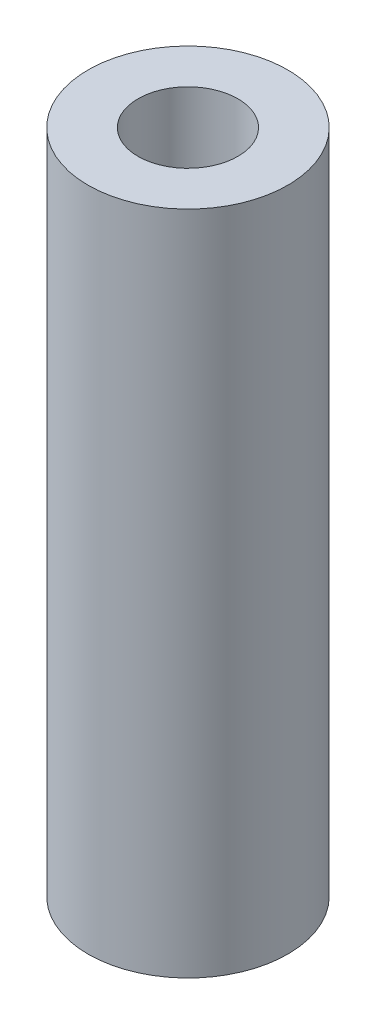
ISO-10303-21;
HEADER;
FILE_DESCRIPTION(('STEP AP214'),'2;1');
FILE_NAME('part.step','',(''),(''),'','','');
FILE_SCHEMA(('AUTOMOTIVE_DESIGN { 1 0 10303 214 1 1 1 1 }'));
ENDSEC;
DATA;
#1=APPLICATION_CONTEXT('core data for automotive mechanical design processes');
#2=APPLICATION_PROTOCOL_DEFINITION('international standard','automotive_design',2000,#1);
#3=PRODUCT_CONTEXT('',#1,'mechanical');
#4=PRODUCT('Part','Part','',(#3));
#5=PRODUCT_RELATED_PRODUCT_CATEGORY('part','',(#4));
#6=PRODUCT_DEFINITION_FORMATION('','',#4);
#7=PRODUCT_DEFINITION_CONTEXT('part definition',#1,'design');
#8=PRODUCT_DEFINITION('design','',#6,#7);
#9=PRODUCT_DEFINITION_SHAPE('','',#8);
#10=(LENGTH_UNIT() NAMED_UNIT(*) SI_UNIT(.MILLI.,.METRE.));
#11=(NAMED_UNIT(*) PLANE_ANGLE_UNIT() SI_UNIT($,.RADIAN.));
#12=(NAMED_UNIT(*) SI_UNIT($,.STERADIAN.) SOLID_ANGLE_UNIT());
#13=UNCERTAINTY_MEASURE_WITH_UNIT(LENGTH_MEASURE(1.E-05),#10,'distance_accuracy_value','');
#14=(GEOMETRIC_REPRESENTATION_CONTEXT(3) GLOBAL_UNCERTAINTY_ASSIGNED_CONTEXT((#13)) GLOBAL_UNIT_ASSIGNED_CONTEXT((#10,
#11,#12)) REPRESENTATION_CONTEXT('',''));
#15=CARTESIAN_POINT('',(0.,0.,0.));
#16=DIRECTION('',(0.,0.,1.));
#17=DIRECTION('',(1.,0.,0.));
#18=AXIS2_PLACEMENT_3D('',#15,#16,#17);
#19=CARTESIAN_POINT('',(0.,20.,0.));
#20=DIRECTION('',(0.,1.,0.));
#21=DIRECTION('',(0.,0.,1.));
#22=AXIS2_PLACEMENT_3D('',#19,#20,#21);
#23=PLANE('',#22);
#24=CARTESIAN_POINT('',(0.,20.,0.));
#25=DIRECTION('',(0.,1.,0.));
#26=DIRECTION('',(0.,0.,1.));
#27=AXIS2_PLACEMENT_3D('',#24,#25,#26);
#28=CIRCLE('',#27,3.);
#29=CARTESIAN_POINT('',(0.,20.,3.));
#30=VERTEX_POINT('',#29);
#31=EDGE_CURVE('E10',#30,#30,#28,.T.);
#32=ORIENTED_EDGE('',*,*,#31,.T.);
#33=EDGE_LOOP('',(#32));
#34=FACE_BOUND('',#33,.T.);
#35=CARTESIAN_POINT('',(0.,20.,0.));
#36=DIRECTION('',(0.,1.,0.));
#37=DIRECTION('',(0.,0.,1.));
#38=AXIS2_PLACEMENT_3D('',#35,#36,#37);
#39=CIRCLE('',#38,1.5);
#40=CARTESIAN_POINT('',(0.,20.,1.5));
#41=VERTEX_POINT('',#40);
#42=EDGE_CURVE('E52',#41,#41,#39,.T.);
#43=ORIENTED_EDGE('',*,*,#42,.F.);
#44=EDGE_LOOP('',(#43));
#45=FACE_BOUND('',#44,.T.);
#46=ADVANCED_FACE('F39',(#34,#45),#23,.T.);
#47=CARTESIAN_POINT('',(0.,0.,0.));
#48=DIRECTION('',(0.,1.,0.));
#49=DIRECTION('',(0.,0.,1.));
#50=AXIS2_PLACEMENT_3D('',#47,#48,#49);
#51=PLANE('',#50);
#52=CARTESIAN_POINT('',(0.,0.,0.));
#53=DIRECTION('',(0.,1.,0.));
#54=DIRECTION('',(0.,0.,1.));
#55=AXIS2_PLACEMENT_3D('',#52,#53,#54);
#56=CIRCLE('',#55,3.);
#57=CARTESIAN_POINT('',(0.,0.,3.));
#58=VERTEX_POINT('',#57);
#59=EDGE_CURVE('E43',#58,#58,#56,.T.);
#60=ORIENTED_EDGE('',*,*,#59,.F.);
#61=EDGE_LOOP('',(#60));
#62=FACE_BOUND('',#61,.T.);
#63=CARTESIAN_POINT('',(0.,0.,0.));
#64=DIRECTION('',(0.,1.,0.));
#65=DIRECTION('',(0.,0.,1.));
#66=AXIS2_PLACEMENT_3D('',#63,#64,#65);
#67=CIRCLE('',#66,1.5);
#68=CARTESIAN_POINT('',(0.,0.,1.5));
#69=VERTEX_POINT('',#68);
#70=EDGE_CURVE('E54',#69,#69,#67,.T.);
#71=ORIENTED_EDGE('',*,*,#70,.T.);
#72=EDGE_LOOP('',(#71));
#73=FACE_BOUND('',#72,.T.);
#74=ADVANCED_FACE('F66',(#62,#73),#51,.F.);
#75=CARTESIAN_POINT('',(0.,20.,0.));
#76=DIRECTION('',(0.,-1.,0.));
#77=DIRECTION('',(0.,0.,-1.));
#78=AXIS2_PLACEMENT_3D('',#75,#76,#77);
#79=CYLINDRICAL_SURFACE('',#78,3.);
#80=ORIENTED_EDGE('',*,*,#31,.F.);
#81=EDGE_LOOP('',(#80));
#82=FACE_BOUND('',#81,.T.);
#83=ORIENTED_EDGE('',*,*,#59,.T.);
#84=EDGE_LOOP('',(#83));
#85=FACE_BOUND('',#84,.T.);
#86=ADVANCED_FACE('F41',(#82,#85),#79,.T.);
#87=CARTESIAN_POINT('',(0.,20.,0.));
#88=DIRECTION('',(0.,-1.,0.));
#89=DIRECTION('',(0.,0.,-1.));
#90=AXIS2_PLACEMENT_3D('',#87,#88,#89);
#91=CYLINDRICAL_SURFACE('',#90,1.5);
#92=ORIENTED_EDGE('',*,*,#42,.T.);
#93=EDGE_LOOP('',(#92));
#94=FACE_BOUND('',#93,.T.);
#95=ORIENTED_EDGE('',*,*,#70,.F.);
#96=EDGE_LOOP('',(#95));
#97=FACE_BOUND('',#96,.T.);
#98=ADVANCED_FACE('F62',(#94,#97),#91,.F.);
#99=CLOSED_SHELL('',(#46,#74,#86,#98));
#100=MANIFOLD_SOLID_BREP('B2',#99);
#101=ADVANCED_BREP_SHAPE_REPRESENTATION('',(#18,#100),#14);
#102=SHAPE_DEFINITION_REPRESENTATION(#9,#101);
ENDSEC;
END-ISO-10303-21;
